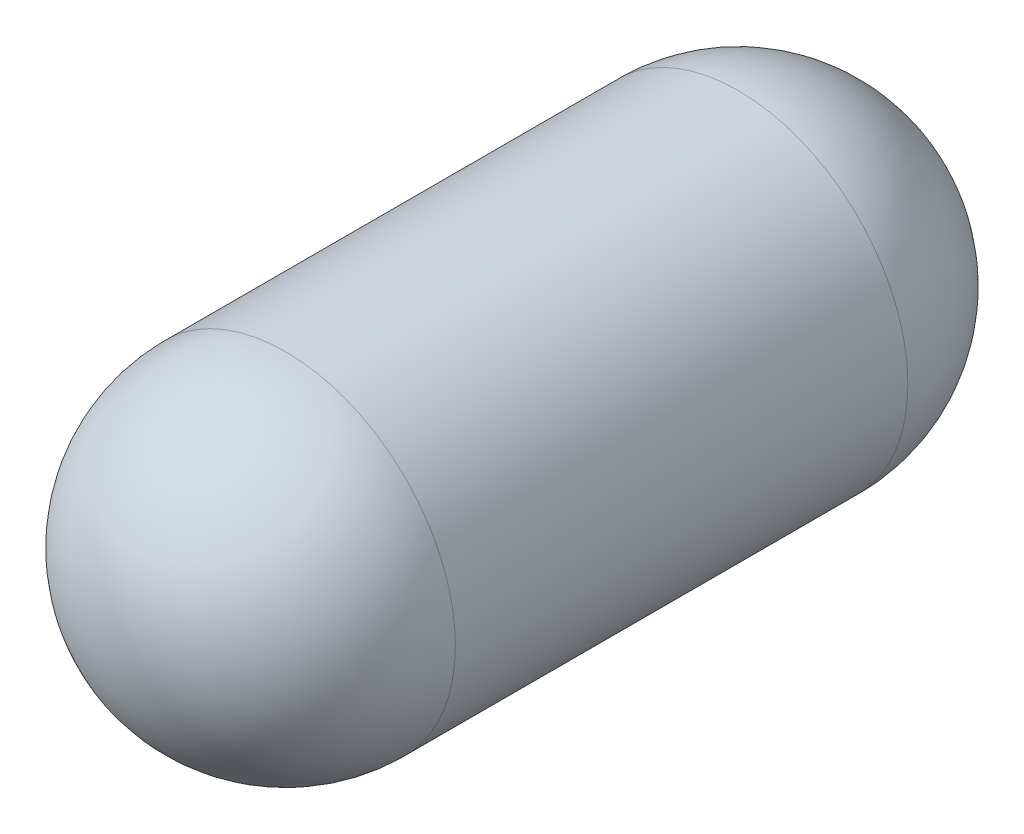
ISO-10303-21;
HEADER;
FILE_DESCRIPTION(('STEP AP214'),'2;1');
FILE_NAME('part.step','',(''),(''),'','','');
FILE_SCHEMA(('AUTOMOTIVE_DESIGN { 1 0 10303 214 1 1 1 1 }'));
ENDSEC;
DATA;
#1=APPLICATION_CONTEXT('core data for automotive mechanical design processes');
#2=APPLICATION_PROTOCOL_DEFINITION('international standard','automotive_design',2000,#1);
#3=PRODUCT_CONTEXT('',#1,'mechanical');
#4=PRODUCT('Part','Part','',(#3));
#5=PRODUCT_RELATED_PRODUCT_CATEGORY('part','',(#4));
#6=PRODUCT_DEFINITION_FORMATION('','',#4);
#7=PRODUCT_DEFINITION_CONTEXT('part definition',#1,'design');
#8=PRODUCT_DEFINITION('design','',#6,#7);
#9=PRODUCT_DEFINITION_SHAPE('','',#8);
#10=(LENGTH_UNIT() NAMED_UNIT(*) SI_UNIT(.MILLI.,.METRE.));
#11=(NAMED_UNIT(*) PLANE_ANGLE_UNIT() SI_UNIT($,.RADIAN.));
#12=(NAMED_UNIT(*) SI_UNIT($,.STERADIAN.) SOLID_ANGLE_UNIT());
#13=UNCERTAINTY_MEASURE_WITH_UNIT(LENGTH_MEASURE(1.E-05),#10,'distance_accuracy_value','');
#14=(GEOMETRIC_REPRESENTATION_CONTEXT(3) GLOBAL_UNCERTAINTY_ASSIGNED_CONTEXT((#13)) GLOBAL_UNIT_ASSIGNED_CONTEXT((#10,
#11,#12)) REPRESENTATION_CONTEXT('',''));
#15=CARTESIAN_POINT('',(0.,0.,0.));
#16=DIRECTION('',(0.,0.,1.));
#17=DIRECTION('',(1.,0.,0.));
#18=AXIS2_PLACEMENT_3D('',#15,#16,#17);
#19=CARTESIAN_POINT('',(0.,0.,25.4));
#20=DIRECTION('',(0.,0.,-1.));
#21=DIRECTION('',(-1.,0.,0.));
#22=AXIS2_PLACEMENT_3D('',#19,#20,#21);
#23=CYLINDRICAL_SURFACE('',#22,9.525);
#24=CARTESIAN_POINT('',(0.,0.,25.4));
#25=DIRECTION('',(0.,0.,1.));
#26=DIRECTION('',(1.,0.,0.));
#27=AXIS2_PLACEMENT_3D('',#24,#25,#26);
#28=CIRCLE('',#27,9.525);
#29=CARTESIAN_POINT('',(9.525,0.,25.4));
#30=VERTEX_POINT('',#29);
#31=EDGE_CURVE('E10',#30,#30,#28,.T.);
#32=ORIENTED_EDGE('',*,*,#31,.F.);
#33=EDGE_LOOP('',(#32));
#34=FACE_BOUND('',#33,.T.);
#35=CARTESIAN_POINT('',(0.,0.,0.));
#36=DIRECTION('',(0.,0.,1.));
#37=DIRECTION('',(1.,0.,0.));
#38=AXIS2_PLACEMENT_3D('',#35,#36,#37);
#39=CIRCLE('',#38,9.525);
#40=CARTESIAN_POINT('',(9.525,0.,0.));
#41=VERTEX_POINT('',#40);
#42=EDGE_CURVE('E38',#41,#41,#39,.F.);
#43=ORIENTED_EDGE('',*,*,#42,.F.);
#44=EDGE_LOOP('',(#43));
#45=FACE_BOUND('',#44,.T.);
#46=ADVANCED_FACE('F32',(#34,#45),#23,.T.);
#47=CARTESIAN_POINT('',(0.,0.,0.));
#48=DIRECTION('',(0.,1.,0.));
#49=DIRECTION('',(0.,0.,-1.));
#50=AXIS2_PLACEMENT_3D('',#47,#48,#49);
#51=SPHERICAL_SURFACE('',#50,9.525);
#52=CARTESIAN_POINT('',(0.,0.,0.));
#53=DIRECTION('',(0.,0.,1.));
#54=DIRECTION('',(1.,0.,0.));
#55=AXIS2_PLACEMENT_3D('',#52,#53,#54);
#56=SPHERICAL_SURFACE('',#55,9.525);
#57=ORIENTED_EDGE('',*,*,#42,.T.);
#58=EDGE_LOOP('',(#57));
#59=FACE_BOUND('',#58,.T.);
#60=ADVANCED_FACE('F44',(#59),#56,.T.);
#61=CARTESIAN_POINT('',(0.,0.,25.4));
#62=DIRECTION('',(0.,1.,0.));
#63=DIRECTION('',(0.,0.,-1.));
#64=AXIS2_PLACEMENT_3D('',#61,#62,#63);
#65=SPHERICAL_SURFACE('',#64,9.525);
#66=CARTESIAN_POINT('',(0.,0.,25.4));
#67=DIRECTION('',(0.,0.,1.));
#68=DIRECTION('',(1.,0.,0.));
#69=AXIS2_PLACEMENT_3D('',#66,#67,#68);
#70=SPHERICAL_SURFACE('',#69,9.525);
#71=ORIENTED_EDGE('',*,*,#31,.T.);
#72=EDGE_LOOP('',(#71));
#73=FACE_BOUND('',#72,.T.);
#74=ADVANCED_FACE('F51',(#73),#70,.T.);
#75=CLOSED_SHELL('',(#46,#60,#74));
#76=MANIFOLD_SOLID_BREP('B2',#75);
#77=ADVANCED_BREP_SHAPE_REPRESENTATION('',(#18,#76),#14);
#78=SHAPE_DEFINITION_REPRESENTATION(#9,#77);
ENDSEC;
END-ISO-10303-21;
